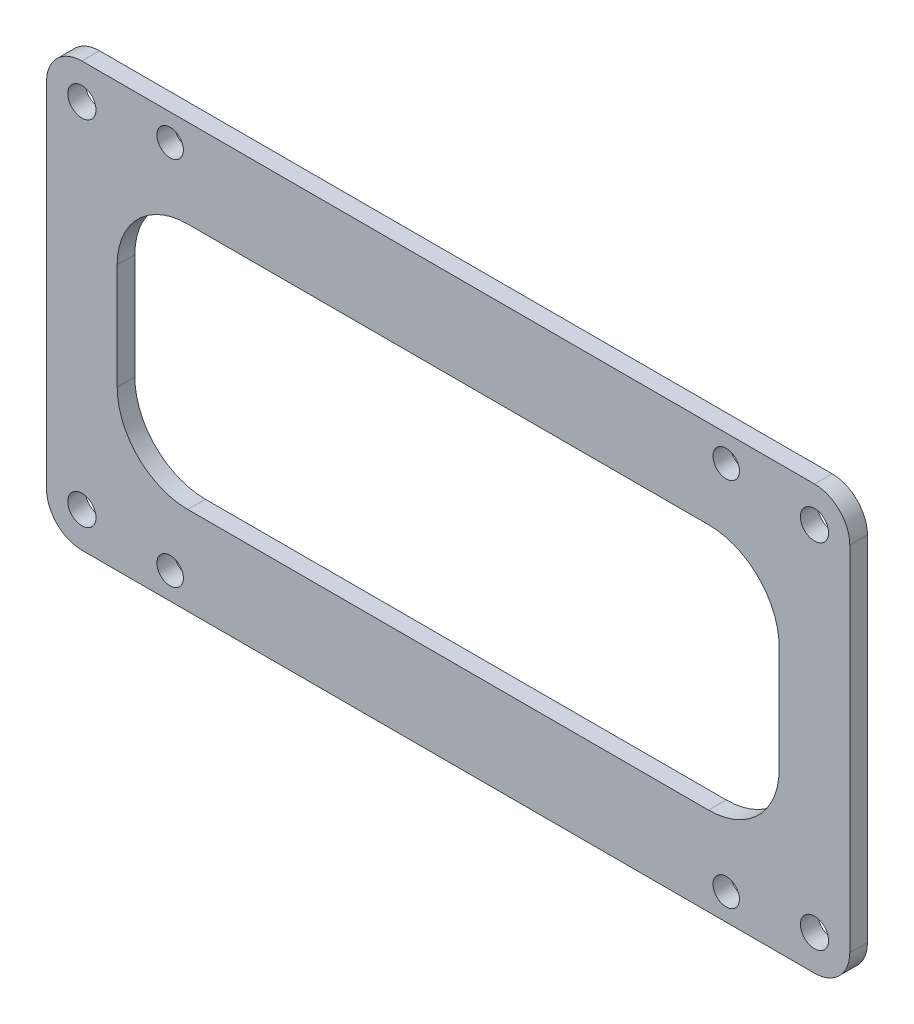
ISO-10303-21;
HEADER;
FILE_DESCRIPTION(('STEP AP214'),'2;1');
FILE_NAME('part.step','',(''),(''),'','','');
FILE_SCHEMA(('AUTOMOTIVE_DESIGN { 1 0 10303 214 1 1 1 1 }'));
ENDSEC;
DATA;
#1=APPLICATION_CONTEXT('core data for automotive mechanical design processes');
#2=APPLICATION_PROTOCOL_DEFINITION('international standard','automotive_design',2000,#1);
#3=PRODUCT_CONTEXT('',#1,'mechanical');
#4=PRODUCT('Part','Part','',(#3));
#5=PRODUCT_RELATED_PRODUCT_CATEGORY('part','',(#4));
#6=PRODUCT_DEFINITION_FORMATION('','',#4);
#7=PRODUCT_DEFINITION_CONTEXT('part definition',#1,'design');
#8=PRODUCT_DEFINITION('design','',#6,#7);
#9=PRODUCT_DEFINITION_SHAPE('','',#8);
#10=(LENGTH_UNIT() NAMED_UNIT(*) SI_UNIT(.MILLI.,.METRE.));
#11=(NAMED_UNIT(*) PLANE_ANGLE_UNIT() SI_UNIT($,.RADIAN.));
#12=(NAMED_UNIT(*) SI_UNIT($,.STERADIAN.) SOLID_ANGLE_UNIT());
#13=UNCERTAINTY_MEASURE_WITH_UNIT(LENGTH_MEASURE(1.E-05),#10,'distance_accuracy_value','');
#14=(GEOMETRIC_REPRESENTATION_CONTEXT(3) GLOBAL_UNCERTAINTY_ASSIGNED_CONTEXT((#13)) GLOBAL_UNIT_ASSIGNED_CONTEXT((#10,
#11,#12)) REPRESENTATION_CONTEXT('',''));
#15=CARTESIAN_POINT('',(0.,0.,0.));
#16=DIRECTION('',(0.,0.,1.));
#17=DIRECTION('',(1.,0.,0.));
#18=AXIS2_PLACEMENT_3D('',#15,#16,#17);
#19=CARTESIAN_POINT('',(-41.5,-20.,2.));
#20=DIRECTION('',(0.,0.,-1.));
#21=DIRECTION('',(-1.,0.,0.));
#22=AXIS2_PLACEMENT_3D('',#19,#20,#21);
#23=PLANE('',#22);
#24=CARTESIAN_POINT('',(41.5,-20.,2.));
#25=DIRECTION('',(0.,0.,1.));
#26=DIRECTION('',(1.,0.,0.));
#27=AXIS2_PLACEMENT_3D('',#24,#25,#26);
#28=CIRCLE('',#27,1.6);
#29=CARTESIAN_POINT('',(43.1,-20.,2.));
#30=VERTEX_POINT('',#29);
#31=EDGE_CURVE('E348',#30,#30,#28,.T.);
#32=ORIENTED_EDGE('',*,*,#31,.F.);
#33=EDGE_LOOP('',(#32));
#34=FACE_BOUND('',#33,.T.);
#35=CARTESIAN_POINT('',(41.5,20.,2.));
#36=DIRECTION('',(0.,0.,1.));
#37=DIRECTION('',(1.,0.,0.));
#38=AXIS2_PLACEMENT_3D('',#35,#36,#37);
#39=CIRCLE('',#38,1.6);
#40=CARTESIAN_POINT('',(43.1,20.,2.));
#41=VERTEX_POINT('',#40);
#42=EDGE_CURVE('E335',#41,#41,#39,.T.);
#43=ORIENTED_EDGE('',*,*,#42,.F.);
#44=EDGE_LOOP('',(#43));
#45=FACE_BOUND('',#44,.T.);
#46=CARTESIAN_POINT('',(-41.5,-20.,2.));
#47=DIRECTION('',(0.,0.,1.));
#48=DIRECTION('',(1.,0.,0.));
#49=AXIS2_PLACEMENT_3D('',#46,#47,#48);
#50=CIRCLE('',#49,1.6);
#51=CARTESIAN_POINT('',(-39.9,-20.,2.));
#52=VERTEX_POINT('',#51);
#53=EDGE_CURVE('E328',#52,#52,#50,.T.);
#54=ORIENTED_EDGE('',*,*,#53,.F.);
#55=EDGE_LOOP('',(#54));
#56=FACE_BOUND('',#55,.T.);
#57=CARTESIAN_POINT('',(-41.5,20.,2.));
#58=DIRECTION('',(0.,0.,1.));
#59=DIRECTION('',(1.,0.,0.));
#60=AXIS2_PLACEMENT_3D('',#57,#58,#59);
#61=CIRCLE('',#60,1.6);
#62=CARTESIAN_POINT('',(-39.9,20.,2.));
#63=VERTEX_POINT('',#62);
#64=EDGE_CURVE('E327',#63,#63,#61,.T.);
#65=ORIENTED_EDGE('',*,*,#64,.F.);
#66=EDGE_LOOP('',(#65));
#67=FACE_BOUND('',#66,.T.);
#68=CARTESIAN_POINT('',(-31.5,-21.,2.));
#69=DIRECTION('',(0.,0.,1.));
#70=DIRECTION('',(1.,0.,0.));
#71=AXIS2_PLACEMENT_3D('',#68,#69,#70);
#72=CIRCLE('',#71,1.5);
#73=CARTESIAN_POINT('',(-30.,-21.,2.));
#74=VERTEX_POINT('',#73);
#75=EDGE_CURVE('E312',#74,#74,#72,.T.);
#76=ORIENTED_EDGE('',*,*,#75,.F.);
#77=EDGE_LOOP('',(#76));
#78=FACE_BOUND('',#77,.T.);
#79=CARTESIAN_POINT('',(31.5,-21.,2.));
#80=DIRECTION('',(0.,0.,1.));
#81=DIRECTION('',(1.,0.,0.));
#82=AXIS2_PLACEMENT_3D('',#79,#80,#81);
#83=CIRCLE('',#82,1.5);
#84=CARTESIAN_POINT('',(33.,-21.,2.));
#85=VERTEX_POINT('',#84);
#86=EDGE_CURVE('E305',#85,#85,#83,.T.);
#87=ORIENTED_EDGE('',*,*,#86,.F.);
#88=EDGE_LOOP('',(#87));
#89=FACE_BOUND('',#88,.T.);
#90=CARTESIAN_POINT('',(31.5,21.,2.));
#91=DIRECTION('',(0.,0.,1.));
#92=DIRECTION('',(1.,0.,0.));
#93=AXIS2_PLACEMENT_3D('',#90,#91,#92);
#94=CIRCLE('',#93,1.5);
#95=CARTESIAN_POINT('',(33.,21.,2.));
#96=VERTEX_POINT('',#95);
#97=EDGE_CURVE('E304',#96,#96,#94,.T.);
#98=ORIENTED_EDGE('',*,*,#97,.F.);
#99=EDGE_LOOP('',(#98));
#100=FACE_BOUND('',#99,.T.);
#101=CARTESIAN_POINT('',(-31.5,21.,2.));
#102=DIRECTION('',(0.,0.,1.));
#103=DIRECTION('',(1.,0.,0.));
#104=AXIS2_PLACEMENT_3D('',#101,#102,#103);
#105=CIRCLE('',#104,1.5);
#106=CARTESIAN_POINT('',(-30.,21.,2.));
#107=VERTEX_POINT('',#106);
#108=EDGE_CURVE('E214',#107,#107,#105,.T.);
#109=ORIENTED_EDGE('',*,*,#108,.F.);
#110=EDGE_LOOP('',(#109));
#111=FACE_BOUND('',#110,.T.);
#112=CARTESIAN_POINT('',(-41.5,-20.,2.));
#113=DIRECTION('',(0.,0.,1.));
#114=DIRECTION('',(-1.,0.,0.));
#115=AXIS2_PLACEMENT_3D('',#112,#113,#114);
#116=CIRCLE('',#115,4.);
#117=CARTESIAN_POINT('',(-45.5,-20.,2.));
#118=VERTEX_POINT('',#117);
#119=CARTESIAN_POINT('',(-41.5,-24.,2.));
#120=VERTEX_POINT('',#119);
#121=EDGE_CURVE('E228',#118,#120,#116,.T.);
#122=ORIENTED_EDGE('',*,*,#121,.T.);
#123=DIRECTION('',(1.,0.,0.));
#124=VECTOR('',#123,1.);
#125=CARTESIAN_POINT('',(41.5,-24.,2.));
#126=LINE('',#125,#124);
#127=CARTESIAN_POINT('',(41.5,-24.,2.));
#128=VERTEX_POINT('',#127);
#129=EDGE_CURVE('E287',#120,#128,#126,.T.);
#130=ORIENTED_EDGE('',*,*,#129,.T.);
#131=CARTESIAN_POINT('',(41.5,-20.,2.));
#132=DIRECTION('',(0.,0.,1.));
#133=DIRECTION('',(1.,0.,0.));
#134=AXIS2_PLACEMENT_3D('',#131,#132,#133);
#135=CIRCLE('',#134,4.);
#136=CARTESIAN_POINT('',(45.5,-20.,2.));
#137=VERTEX_POINT('',#136);
#138=EDGE_CURVE('E252',#128,#137,#135,.T.);
#139=ORIENTED_EDGE('',*,*,#138,.T.);
#140=DIRECTION('',(0.,1.,0.));
#141=VECTOR('',#140,1.);
#142=CARTESIAN_POINT('',(45.5,-20.,2.));
#143=LINE('',#142,#141);
#144=CARTESIAN_POINT('',(45.5,20.,2.));
#145=VERTEX_POINT('',#144);
#146=EDGE_CURVE('E273',#137,#145,#143,.T.);
#147=ORIENTED_EDGE('',*,*,#146,.T.);
#148=CARTESIAN_POINT('',(41.5,20.,2.));
#149=DIRECTION('',(0.,0.,1.));
#150=DIRECTION('',(1.,0.,0.));
#151=AXIS2_PLACEMENT_3D('',#148,#149,#150);
#152=CIRCLE('',#151,4.);
#153=CARTESIAN_POINT('',(41.5,24.,2.));
#154=VERTEX_POINT('',#153);
#155=EDGE_CURVE('E269',#145,#154,#152,.T.);
#156=ORIENTED_EDGE('',*,*,#155,.T.);
#157=DIRECTION('',(-1.,0.,0.));
#158=VECTOR('',#157,1.);
#159=CARTESIAN_POINT('',(41.5,24.,2.));
#160=LINE('',#159,#158);
#161=CARTESIAN_POINT('',(-41.5,24.,2.));
#162=VERTEX_POINT('',#161);
#163=EDGE_CURVE('E272',#154,#162,#160,.T.);
#164=ORIENTED_EDGE('',*,*,#163,.T.);
#165=CARTESIAN_POINT('',(-41.5,20.,2.));
#166=DIRECTION('',(0.,0.,1.));
#167=DIRECTION('',(1.,0.,0.));
#168=AXIS2_PLACEMENT_3D('',#165,#166,#167);
#169=CIRCLE('',#168,4.);
#170=CARTESIAN_POINT('',(-45.5,20.,2.));
#171=VERTEX_POINT('',#170);
#172=EDGE_CURVE('E207',#162,#171,#169,.T.);
#173=ORIENTED_EDGE('',*,*,#172,.T.);
#174=DIRECTION('',(0.,-1.,0.));
#175=VECTOR('',#174,1.);
#176=CARTESIAN_POINT('',(-45.5,-20.,2.));
#177=LINE('',#176,#175);
#178=EDGE_CURVE('E203',#171,#118,#177,.T.);
#179=ORIENTED_EDGE('',*,*,#178,.T.);
#180=EDGE_LOOP('',(#122,#130,#139,#147,#156,#164,#173,#179));
#181=FACE_BOUND('',#180,.T.);
#182=CARTESIAN_POINT('',(-29.5,-6.00000000000001,2.));
#183=DIRECTION('',(0.,0.,1.));
#184=DIRECTION('',(-1.,0.,0.));
#185=AXIS2_PLACEMENT_3D('',#182,#183,#184);
#186=CIRCLE('',#185,8.);
#187=CARTESIAN_POINT('',(-37.5,-6.00000000000001,2.));
#188=VERTEX_POINT('',#187);
#189=CARTESIAN_POINT('',(-29.5,-14.,2.));
#190=VERTEX_POINT('',#189);
#191=EDGE_CURVE('E150',#188,#190,#186,.T.);
#192=ORIENTED_EDGE('',*,*,#191,.F.);
#193=DIRECTION('',(0.,-1.,0.));
#194=VECTOR('',#193,1.);
#195=CARTESIAN_POINT('',(-37.5,-6.00000000000001,2.));
#196=LINE('',#195,#194);
#197=CARTESIAN_POINT('',(-37.5,5.99999999999999,2.));
#198=VERTEX_POINT('',#197);
#199=EDGE_CURVE('E193',#198,#188,#196,.T.);
#200=ORIENTED_EDGE('',*,*,#199,.F.);
#201=CARTESIAN_POINT('',(-29.5,5.99999999999999,2.));
#202=DIRECTION('',(0.,0.,1.));
#203=DIRECTION('',(1.,0.,0.));
#204=AXIS2_PLACEMENT_3D('',#201,#202,#203);
#205=CIRCLE('',#204,8.);
#206=CARTESIAN_POINT('',(-29.5,14.,2.));
#207=VERTEX_POINT('',#206);
#208=EDGE_CURVE('E190',#207,#198,#205,.T.);
#209=ORIENTED_EDGE('',*,*,#208,.F.);
#210=DIRECTION('',(-1.,0.,0.));
#211=VECTOR('',#210,1.);
#212=CARTESIAN_POINT('',(29.5,14.,2.));
#213=LINE('',#212,#211);
#214=CARTESIAN_POINT('',(29.5,14.,2.));
#215=VERTEX_POINT('',#214);
#216=EDGE_CURVE('E187',#215,#207,#213,.T.);
#217=ORIENTED_EDGE('',*,*,#216,.F.);
#218=CARTESIAN_POINT('',(29.5,5.99999999999999,2.));
#219=DIRECTION('',(0.,0.,1.));
#220=DIRECTION('',(1.,0.,0.));
#221=AXIS2_PLACEMENT_3D('',#218,#219,#220);
#222=CIRCLE('',#221,8.);
#223=CARTESIAN_POINT('',(37.5,5.99999999999999,2.));
#224=VERTEX_POINT('',#223);
#225=EDGE_CURVE('E185',#224,#215,#222,.T.);
#226=ORIENTED_EDGE('',*,*,#225,.F.);
#227=DIRECTION('',(0.,1.,0.));
#228=VECTOR('',#227,1.);
#229=CARTESIAN_POINT('',(37.5,-6.00000000000001,2.));
#230=LINE('',#229,#228);
#231=CARTESIAN_POINT('',(37.5,-6.00000000000001,2.));
#232=VERTEX_POINT('',#231);
#233=EDGE_CURVE('E172',#232,#224,#230,.T.);
#234=ORIENTED_EDGE('',*,*,#233,.F.);
#235=CARTESIAN_POINT('',(29.5,-6.00000000000001,2.));
#236=DIRECTION('',(0.,0.,1.));
#237=DIRECTION('',(1.,0.,0.));
#238=AXIS2_PLACEMENT_3D('',#235,#236,#237);
#239=CIRCLE('',#238,8.);
#240=CARTESIAN_POINT('',(29.5,-14.,2.));
#241=VERTEX_POINT('',#240);
#242=EDGE_CURVE('E171',#241,#232,#239,.T.);
#243=ORIENTED_EDGE('',*,*,#242,.F.);
#244=DIRECTION('',(1.,0.,0.));
#245=VECTOR('',#244,1.);
#246=CARTESIAN_POINT('',(29.5,-14.,2.));
#247=LINE('',#246,#245);
#248=EDGE_CURVE('E158',#190,#241,#247,.T.);
#249=ORIENTED_EDGE('',*,*,#248,.F.);
#250=EDGE_LOOP('',(#192,#200,#209,#217,#226,#234,#243,#249));
#251=FACE_BOUND('',#250,.T.);
#252=ADVANCED_FACE('F37',(#34,#45,#56,#67,#78,#89,#100,#111,#181,#251),#23,.F.);
#253=CARTESIAN_POINT('',(-41.5,-20.,0.));
#254=DIRECTION('',(0.,0.,-1.));
#255=DIRECTION('',(-1.,0.,0.));
#256=AXIS2_PLACEMENT_3D('',#253,#254,#255);
#257=PLANE('',#256);
#258=CARTESIAN_POINT('',(41.5,20.,0.));
#259=DIRECTION('',(0.,0.,1.));
#260=DIRECTION('',(1.,0.,0.));
#261=AXIS2_PLACEMENT_3D('',#258,#259,#260);
#262=CIRCLE('',#261,1.6);
#263=CARTESIAN_POINT('',(43.1,20.,0.));
#264=VERTEX_POINT('',#263);
#265=EDGE_CURVE('E339',#264,#264,#262,.T.);
#266=ORIENTED_EDGE('',*,*,#265,.T.);
#267=EDGE_LOOP('',(#266));
#268=FACE_BOUND('',#267,.T.);
#269=CARTESIAN_POINT('',(-41.5,20.,0.));
#270=DIRECTION('',(0.,0.,1.));
#271=DIRECTION('',(1.,0.,0.));
#272=AXIS2_PLACEMENT_3D('',#269,#270,#271);
#273=CIRCLE('',#272,1.6);
#274=CARTESIAN_POINT('',(-39.9,20.,0.));
#275=VERTEX_POINT('',#274);
#276=EDGE_CURVE('E325',#275,#275,#273,.T.);
#277=ORIENTED_EDGE('',*,*,#276,.T.);
#278=EDGE_LOOP('',(#277));
#279=FACE_BOUND('',#278,.T.);
#280=CARTESIAN_POINT('',(31.5,-21.,0.));
#281=DIRECTION('',(0.,0.,1.));
#282=DIRECTION('',(1.,0.,0.));
#283=AXIS2_PLACEMENT_3D('',#280,#281,#282);
#284=CIRCLE('',#283,1.5);
#285=CARTESIAN_POINT('',(33.,-21.,0.));
#286=VERTEX_POINT('',#285);
#287=EDGE_CURVE('E309',#286,#286,#284,.T.);
#288=ORIENTED_EDGE('',*,*,#287,.T.);
#289=EDGE_LOOP('',(#288));
#290=FACE_BOUND('',#289,.T.);
#291=CARTESIAN_POINT('',(-31.5,21.,0.));
#292=DIRECTION('',(0.,0.,1.));
#293=DIRECTION('',(1.,0.,0.));
#294=AXIS2_PLACEMENT_3D('',#291,#292,#293);
#295=CIRCLE('',#294,1.5);
#296=CARTESIAN_POINT('',(-30.,21.,0.));
#297=VERTEX_POINT('',#296);
#298=EDGE_CURVE('E293',#297,#297,#295,.T.);
#299=ORIENTED_EDGE('',*,*,#298,.T.);
#300=EDGE_LOOP('',(#299));
#301=FACE_BOUND('',#300,.T.);
#302=CARTESIAN_POINT('',(-41.5,-20.,0.));
#303=DIRECTION('',(0.,0.,1.));
#304=DIRECTION('',(-1.,0.,0.));
#305=AXIS2_PLACEMENT_3D('',#302,#303,#304);
#306=CIRCLE('',#305,4.);
#307=CARTESIAN_POINT('',(-45.5,-20.,0.));
#308=VERTEX_POINT('',#307);
#309=CARTESIAN_POINT('',(-41.5,-24.,0.));
#310=VERTEX_POINT('',#309);
#311=EDGE_CURVE('E210',#308,#310,#306,.T.);
#312=ORIENTED_EDGE('',*,*,#311,.F.);
#313=DIRECTION('',(0.,-1.,0.));
#314=VECTOR('',#313,1.);
#315=CARTESIAN_POINT('',(-45.5,-20.,0.));
#316=LINE('',#315,#314);
#317=CARTESIAN_POINT('',(-45.5,20.,0.));
#318=VERTEX_POINT('',#317);
#319=EDGE_CURVE('E226',#318,#308,#316,.T.);
#320=ORIENTED_EDGE('',*,*,#319,.F.);
#321=CARTESIAN_POINT('',(-41.5,20.,0.));
#322=DIRECTION('',(0.,0.,1.));
#323=DIRECTION('',(1.,0.,0.));
#324=AXIS2_PLACEMENT_3D('',#321,#322,#323);
#325=CIRCLE('',#324,4.);
#326=CARTESIAN_POINT('',(-41.5,24.,0.));
#327=VERTEX_POINT('',#326);
#328=EDGE_CURVE('E224',#327,#318,#325,.T.);
#329=ORIENTED_EDGE('',*,*,#328,.F.);
#330=DIRECTION('',(-1.,0.,0.));
#331=VECTOR('',#330,1.);
#332=CARTESIAN_POINT('',(41.5,24.,0.));
#333=LINE('',#332,#331);
#334=CARTESIAN_POINT('',(41.5,24.,0.));
#335=VERTEX_POINT('',#334);
#336=EDGE_CURVE('E222',#335,#327,#333,.T.);
#337=ORIENTED_EDGE('',*,*,#336,.F.);
#338=CARTESIAN_POINT('',(41.5,20.,0.));
#339=DIRECTION('',(0.,0.,1.));
#340=DIRECTION('',(1.,0.,0.));
#341=AXIS2_PLACEMENT_3D('',#338,#339,#340);
#342=CIRCLE('',#341,4.);
#343=CARTESIAN_POINT('',(45.5,20.,0.));
#344=VERTEX_POINT('',#343);
#345=EDGE_CURVE('E220',#344,#335,#342,.T.);
#346=ORIENTED_EDGE('',*,*,#345,.F.);
#347=DIRECTION('',(0.,1.,0.));
#348=VECTOR('',#347,1.);
#349=CARTESIAN_POINT('',(45.5,-20.,0.));
#350=LINE('',#349,#348);
#351=CARTESIAN_POINT('',(45.5,-20.,0.));
#352=VERTEX_POINT('',#351);
#353=EDGE_CURVE('E218',#352,#344,#350,.T.);
#354=ORIENTED_EDGE('',*,*,#353,.F.);
#355=CARTESIAN_POINT('',(41.5,-20.,0.));
#356=DIRECTION('',(0.,0.,1.));
#357=DIRECTION('',(1.,0.,0.));
#358=AXIS2_PLACEMENT_3D('',#355,#356,#357);
#359=CIRCLE('',#358,4.);
#360=CARTESIAN_POINT('',(41.5,-24.,0.));
#361=VERTEX_POINT('',#360);
#362=EDGE_CURVE('E216',#361,#352,#359,.T.);
#363=ORIENTED_EDGE('',*,*,#362,.F.);
#364=DIRECTION('',(1.,0.,0.));
#365=VECTOR('',#364,1.);
#366=CARTESIAN_POINT('',(41.5,-24.,0.));
#367=LINE('',#366,#365);
#368=EDGE_CURVE('E213',#310,#361,#367,.T.);
#369=ORIENTED_EDGE('',*,*,#368,.F.);
#370=EDGE_LOOP('',(#312,#320,#329,#337,#346,#354,#363,#369));
#371=FACE_BOUND('',#370,.T.);
#372=CARTESIAN_POINT('',(31.5,21.,0.));
#373=DIRECTION('',(0.,0.,1.));
#374=DIRECTION('',(1.,0.,0.));
#375=AXIS2_PLACEMENT_3D('',#372,#373,#374);
#376=CIRCLE('',#375,1.5);
#377=CARTESIAN_POINT('',(33.,21.,0.));
#378=VERTEX_POINT('',#377);
#379=EDGE_CURVE('E302',#378,#378,#376,.T.);
#380=ORIENTED_EDGE('',*,*,#379,.T.);
#381=EDGE_LOOP('',(#380));
#382=FACE_BOUND('',#381,.T.);
#383=CARTESIAN_POINT('',(-31.5,-21.,0.));
#384=DIRECTION('',(0.,0.,1.));
#385=DIRECTION('',(1.,0.,0.));
#386=AXIS2_PLACEMENT_3D('',#383,#384,#385);
#387=CIRCLE('',#386,1.5);
#388=CARTESIAN_POINT('',(-30.,-21.,0.));
#389=VERTEX_POINT('',#388);
#390=EDGE_CURVE('E316',#389,#389,#387,.T.);
#391=ORIENTED_EDGE('',*,*,#390,.T.);
#392=EDGE_LOOP('',(#391));
#393=FACE_BOUND('',#392,.T.);
#394=CARTESIAN_POINT('',(-41.5,-20.,0.));
#395=DIRECTION('',(0.,0.,1.));
#396=DIRECTION('',(1.,0.,0.));
#397=AXIS2_PLACEMENT_3D('',#394,#395,#396);
#398=CIRCLE('',#397,1.6);
#399=CARTESIAN_POINT('',(-39.9,-20.,0.));
#400=VERTEX_POINT('',#399);
#401=EDGE_CURVE('E332',#400,#400,#398,.T.);
#402=ORIENTED_EDGE('',*,*,#401,.T.);
#403=EDGE_LOOP('',(#402));
#404=FACE_BOUND('',#403,.T.);
#405=CARTESIAN_POINT('',(41.5,-20.,0.));
#406=DIRECTION('',(0.,0.,1.));
#407=DIRECTION('',(1.,0.,0.));
#408=AXIS2_PLACEMENT_3D('',#405,#406,#407);
#409=CIRCLE('',#408,1.6);
#410=CARTESIAN_POINT('',(43.1,-20.,0.));
#411=VERTEX_POINT('',#410);
#412=EDGE_CURVE('E166',#411,#411,#409,.T.);
#413=ORIENTED_EDGE('',*,*,#412,.T.);
#414=EDGE_LOOP('',(#413));
#415=FACE_BOUND('',#414,.T.);
#416=DIRECTION('',(0.,-1.,0.));
#417=VECTOR('',#416,1.);
#418=CARTESIAN_POINT('',(-37.5,-6.00000000000001,0.));
#419=LINE('',#418,#417);
#420=CARTESIAN_POINT('',(-37.5,5.99999999999999,0.));
#421=VERTEX_POINT('',#420);
#422=CARTESIAN_POINT('',(-37.5,-6.00000000000001,0.));
#423=VERTEX_POINT('',#422);
#424=EDGE_CURVE('E159',#421,#423,#419,.T.);
#425=ORIENTED_EDGE('',*,*,#424,.T.);
#426=CARTESIAN_POINT('',(-29.5,-6.00000000000001,0.));
#427=DIRECTION('',(0.,0.,1.));
#428=DIRECTION('',(-1.,0.,0.));
#429=AXIS2_PLACEMENT_3D('',#426,#427,#428);
#430=CIRCLE('',#429,8.);
#431=CARTESIAN_POINT('',(-29.5,-14.,0.));
#432=VERTEX_POINT('',#431);
#433=EDGE_CURVE('E60',#423,#432,#430,.T.);
#434=ORIENTED_EDGE('',*,*,#433,.T.);
#435=DIRECTION('',(1.,0.,0.));
#436=VECTOR('',#435,1.);
#437=CARTESIAN_POINT('',(29.5,-14.,0.));
#438=LINE('',#437,#436);
#439=CARTESIAN_POINT('',(29.5,-14.,0.));
#440=VERTEX_POINT('',#439);
#441=EDGE_CURVE('E165',#432,#440,#438,.T.);
#442=ORIENTED_EDGE('',*,*,#441,.T.);
#443=CARTESIAN_POINT('',(29.5,-6.00000000000001,0.));
#444=DIRECTION('',(0.,0.,1.));
#445=DIRECTION('',(1.,0.,0.));
#446=AXIS2_PLACEMENT_3D('',#443,#444,#445);
#447=CIRCLE('',#446,8.);
#448=CARTESIAN_POINT('',(37.5,-6.00000000000001,0.));
#449=VERTEX_POINT('',#448);
#450=EDGE_CURVE('E377',#440,#449,#447,.T.);
#451=ORIENTED_EDGE('',*,*,#450,.T.);
#452=DIRECTION('',(0.,1.,0.));
#453=VECTOR('',#452,1.);
#454=CARTESIAN_POINT('',(37.5,-6.00000000000001,0.));
#455=LINE('',#454,#453);
#456=CARTESIAN_POINT('',(37.5,5.99999999999999,0.));
#457=VERTEX_POINT('',#456);
#458=EDGE_CURVE('E374',#449,#457,#455,.T.);
#459=ORIENTED_EDGE('',*,*,#458,.T.);
#460=CARTESIAN_POINT('',(29.5,5.99999999999999,0.));
#461=DIRECTION('',(0.,0.,1.));
#462=DIRECTION('',(1.,0.,0.));
#463=AXIS2_PLACEMENT_3D('',#460,#461,#462);
#464=CIRCLE('',#463,8.);
#465=CARTESIAN_POINT('',(29.5,14.,0.));
#466=VERTEX_POINT('',#465);
#467=EDGE_CURVE('E371',#457,#466,#464,.T.);
#468=ORIENTED_EDGE('',*,*,#467,.T.);
#469=DIRECTION('',(-1.,0.,0.));
#470=VECTOR('',#469,1.);
#471=CARTESIAN_POINT('',(29.5,14.,0.));
#472=LINE('',#471,#470);
#473=CARTESIAN_POINT('',(-29.5,14.,0.));
#474=VERTEX_POINT('',#473);
#475=EDGE_CURVE('E368',#466,#474,#472,.T.);
#476=ORIENTED_EDGE('',*,*,#475,.T.);
#477=CARTESIAN_POINT('',(-29.5,5.99999999999999,0.));
#478=DIRECTION('',(0.,0.,1.));
#479=DIRECTION('',(1.,0.,0.));
#480=AXIS2_PLACEMENT_3D('',#477,#478,#479);
#481=CIRCLE('',#480,8.);
#482=EDGE_CURVE('E365',#474,#421,#481,.T.);
#483=ORIENTED_EDGE('',*,*,#482,.T.);
#484=EDGE_LOOP('',(#425,#434,#442,#451,#459,#468,#476,#483));
#485=FACE_BOUND('',#484,.T.);
#486=ADVANCED_FACE('F257',(#268,#279,#290,#301,#371,#382,#393,#404,#415,#485),#257,.T.);
#487=CARTESIAN_POINT('',(-41.5,-20.,2.));
#488=DIRECTION('',(0.,0.,-1.));
#489=DIRECTION('',(-1.,0.,0.));
#490=AXIS2_PLACEMENT_3D('',#487,#488,#489);
#491=CYLINDRICAL_SURFACE('',#490,4.);
#492=ORIENTED_EDGE('',*,*,#311,.T.);
#493=DIRECTION('',(0.,0.,-1.));
#494=VECTOR('',#493,1.);
#495=CARTESIAN_POINT('',(-41.5,-24.,2.));
#496=LINE('',#495,#494);
#497=EDGE_CURVE('E12',#120,#310,#496,.T.);
#498=ORIENTED_EDGE('',*,*,#497,.F.);
#499=ORIENTED_EDGE('',*,*,#121,.F.);
#500=DIRECTION('',(0.,0.,-1.));
#501=VECTOR('',#500,1.);
#502=CARTESIAN_POINT('',(-45.5,-20.,2.));
#503=LINE('',#502,#501);
#504=EDGE_CURVE('E206',#118,#308,#503,.T.);
#505=ORIENTED_EDGE('',*,*,#504,.T.);
#506=EDGE_LOOP('',(#492,#498,#499,#505));
#507=FACE_BOUND('',#506,.T.);
#508=ADVANCED_FACE('F39',(#507),#491,.T.);
#509=CARTESIAN_POINT('',(41.5,-24.,2.));
#510=DIRECTION('',(0.,1.,0.));
#511=DIRECTION('',(-1.,0.,0.));
#512=AXIS2_PLACEMENT_3D('',#509,#510,#511);
#513=PLANE('',#512);
#514=ORIENTED_EDGE('',*,*,#368,.T.);
#515=DIRECTION('',(0.,0.,-1.));
#516=VECTOR('',#515,1.);
#517=CARTESIAN_POINT('',(41.5,-24.,2.));
#518=LINE('',#517,#516);
#519=EDGE_CURVE('E45',#128,#361,#518,.T.);
#520=ORIENTED_EDGE('',*,*,#519,.F.);
#521=ORIENTED_EDGE('',*,*,#129,.F.);
#522=ORIENTED_EDGE('',*,*,#497,.T.);
#523=EDGE_LOOP('',(#514,#520,#521,#522));
#524=FACE_BOUND('',#523,.T.);
#525=ADVANCED_FACE('F443',(#524),#513,.F.);
#526=CARTESIAN_POINT('',(41.5,-20.,2.));
#527=DIRECTION('',(0.,0.,-1.));
#528=DIRECTION('',(-1.,0.,0.));
#529=AXIS2_PLACEMENT_3D('',#526,#527,#528);
#530=CYLINDRICAL_SURFACE('',#529,4.);
#531=ORIENTED_EDGE('',*,*,#362,.T.);
#532=DIRECTION('',(0.,0.,-1.));
#533=VECTOR('',#532,1.);
#534=CARTESIAN_POINT('',(45.5,-20.,2.));
#535=LINE('',#534,#533);
#536=EDGE_CURVE('E243',#137,#352,#535,.T.);
#537=ORIENTED_EDGE('',*,*,#536,.F.);
#538=ORIENTED_EDGE('',*,*,#138,.F.);
#539=ORIENTED_EDGE('',*,*,#519,.T.);
#540=EDGE_LOOP('',(#531,#537,#538,#539));
#541=FACE_BOUND('',#540,.T.);
#542=ADVANCED_FACE('F250',(#541),#530,.T.);
#543=CARTESIAN_POINT('',(45.5,-20.,2.));
#544=DIRECTION('',(-1.,0.,0.));
#545=DIRECTION('',(0.,0.,1.));
#546=AXIS2_PLACEMENT_3D('',#543,#544,#545);
#547=PLANE('',#546);
#548=ORIENTED_EDGE('',*,*,#353,.T.);
#549=DIRECTION('',(0.,0.,-1.));
#550=VECTOR('',#549,1.);
#551=CARTESIAN_POINT('',(45.5,20.,2.));
#552=LINE('',#551,#550);
#553=EDGE_CURVE('E240',#145,#344,#552,.T.);
#554=ORIENTED_EDGE('',*,*,#553,.F.);
#555=ORIENTED_EDGE('',*,*,#146,.F.);
#556=ORIENTED_EDGE('',*,*,#536,.T.);
#557=EDGE_LOOP('',(#548,#554,#555,#556));
#558=FACE_BOUND('',#557,.T.);
#559=ADVANCED_FACE('F263',(#558),#547,.F.);
#560=CARTESIAN_POINT('',(41.5,20.,2.));
#561=DIRECTION('',(0.,0.,-1.));
#562=DIRECTION('',(-1.,0.,0.));
#563=AXIS2_PLACEMENT_3D('',#560,#561,#562);
#564=CYLINDRICAL_SURFACE('',#563,4.);
#565=ORIENTED_EDGE('',*,*,#345,.T.);
#566=DIRECTION('',(0.,0.,-1.));
#567=VECTOR('',#566,1.);
#568=CARTESIAN_POINT('',(41.5,24.,2.));
#569=LINE('',#568,#567);
#570=EDGE_CURVE('E237',#154,#335,#569,.T.);
#571=ORIENTED_EDGE('',*,*,#570,.F.);
#572=ORIENTED_EDGE('',*,*,#155,.F.);
#573=ORIENTED_EDGE('',*,*,#553,.T.);
#574=EDGE_LOOP('',(#565,#571,#572,#573));
#575=FACE_BOUND('',#574,.T.);
#576=ADVANCED_FACE('F267',(#575),#564,.T.);
#577=CARTESIAN_POINT('',(41.5,24.,2.));
#578=DIRECTION('',(0.,-1.,0.));
#579=DIRECTION('',(0.,0.,-1.));
#580=AXIS2_PLACEMENT_3D('',#577,#578,#579);
#581=PLANE('',#580);
#582=ORIENTED_EDGE('',*,*,#336,.T.);
#583=DIRECTION('',(0.,0.,-1.));
#584=VECTOR('',#583,1.);
#585=CARTESIAN_POINT('',(-41.5,24.,2.));
#586=LINE('',#585,#584);
#587=EDGE_CURVE('E234',#162,#327,#586,.T.);
#588=ORIENTED_EDGE('',*,*,#587,.F.);
#589=ORIENTED_EDGE('',*,*,#163,.F.);
#590=ORIENTED_EDGE('',*,*,#570,.T.);
#591=EDGE_LOOP('',(#582,#588,#589,#590));
#592=FACE_BOUND('',#591,.T.);
#593=ADVANCED_FACE('F433',(#592),#581,.F.);
#594=CARTESIAN_POINT('',(-41.5,20.,2.));
#595=DIRECTION('',(0.,0.,-1.));
#596=DIRECTION('',(-1.,0.,0.));
#597=AXIS2_PLACEMENT_3D('',#594,#595,#596);
#598=CYLINDRICAL_SURFACE('',#597,4.);
#599=ORIENTED_EDGE('',*,*,#328,.T.);
#600=DIRECTION('',(0.,0.,-1.));
#601=VECTOR('',#600,1.);
#602=CARTESIAN_POINT('',(-45.5,20.,2.));
#603=LINE('',#602,#601);
#604=EDGE_CURVE('E231',#171,#318,#603,.T.);
#605=ORIENTED_EDGE('',*,*,#604,.F.);
#606=ORIENTED_EDGE('',*,*,#172,.F.);
#607=ORIENTED_EDGE('',*,*,#587,.T.);
#608=EDGE_LOOP('',(#599,#605,#606,#607));
#609=FACE_BOUND('',#608,.T.);
#610=ADVANCED_FACE('F429',(#609),#598,.T.);
#611=CARTESIAN_POINT('',(-45.5,-20.,2.));
#612=DIRECTION('',(1.,0.,0.));
#613=DIRECTION('',(0.,0.,-1.));
#614=AXIS2_PLACEMENT_3D('',#611,#612,#613);
#615=PLANE('',#614);
#616=ORIENTED_EDGE('',*,*,#319,.T.);
#617=ORIENTED_EDGE('',*,*,#504,.F.);
#618=ORIENTED_EDGE('',*,*,#178,.F.);
#619=ORIENTED_EDGE('',*,*,#604,.T.);
#620=EDGE_LOOP('',(#616,#617,#618,#619));
#621=FACE_BOUND('',#620,.T.);
#622=ADVANCED_FACE('F426',(#621),#615,.F.);
#623=CARTESIAN_POINT('',(-31.5,21.,2.));
#624=DIRECTION('',(0.,0.,-1.));
#625=DIRECTION('',(-1.,0.,0.));
#626=AXIS2_PLACEMENT_3D('',#623,#624,#625);
#627=CYLINDRICAL_SURFACE('',#626,1.5);
#628=ORIENTED_EDGE('',*,*,#108,.T.);
#629=EDGE_LOOP('',(#628));
#630=FACE_BOUND('',#629,.T.);
#631=ORIENTED_EDGE('',*,*,#298,.F.);
#632=EDGE_LOOP('',(#631));
#633=FACE_BOUND('',#632,.T.);
#634=ADVANCED_FACE('F423',(#630,#633),#627,.F.);
#635=CARTESIAN_POINT('',(31.5,21.,2.));
#636=DIRECTION('',(0.,0.,-1.));
#637=DIRECTION('',(-1.,0.,0.));
#638=AXIS2_PLACEMENT_3D('',#635,#636,#637);
#639=CYLINDRICAL_SURFACE('',#638,1.5);
#640=ORIENTED_EDGE('',*,*,#97,.T.);
#641=EDGE_LOOP('',(#640));
#642=FACE_BOUND('',#641,.T.);
#643=ORIENTED_EDGE('',*,*,#379,.F.);
#644=EDGE_LOOP('',(#643));
#645=FACE_BOUND('',#644,.T.);
#646=ADVANCED_FACE('F514',(#642,#645),#639,.F.);
#647=CARTESIAN_POINT('',(31.5,-21.,2.));
#648=DIRECTION('',(0.,0.,-1.));
#649=DIRECTION('',(-1.,0.,0.));
#650=AXIS2_PLACEMENT_3D('',#647,#648,#649);
#651=CYLINDRICAL_SURFACE('',#650,1.5);
#652=ORIENTED_EDGE('',*,*,#86,.T.);
#653=EDGE_LOOP('',(#652));
#654=FACE_BOUND('',#653,.T.);
#655=ORIENTED_EDGE('',*,*,#287,.F.);
#656=EDGE_LOOP('',(#655));
#657=FACE_BOUND('',#656,.T.);
#658=ADVANCED_FACE('F522',(#654,#657),#651,.F.);
#659=CARTESIAN_POINT('',(-31.5,-21.,2.));
#660=DIRECTION('',(0.,0.,-1.));
#661=DIRECTION('',(-1.,0.,0.));
#662=AXIS2_PLACEMENT_3D('',#659,#660,#661);
#663=CYLINDRICAL_SURFACE('',#662,1.5);
#664=ORIENTED_EDGE('',*,*,#75,.T.);
#665=EDGE_LOOP('',(#664));
#666=FACE_BOUND('',#665,.T.);
#667=ORIENTED_EDGE('',*,*,#390,.F.);
#668=EDGE_LOOP('',(#667));
#669=FACE_BOUND('',#668,.T.);
#670=ADVANCED_FACE('F530',(#666,#669),#663,.F.);
#671=CARTESIAN_POINT('',(-41.5,20.,2.));
#672=DIRECTION('',(0.,0.,-1.));
#673=DIRECTION('',(-1.,0.,0.));
#674=AXIS2_PLACEMENT_3D('',#671,#672,#673);
#675=CYLINDRICAL_SURFACE('',#674,1.6);
#676=ORIENTED_EDGE('',*,*,#64,.T.);
#677=EDGE_LOOP('',(#676));
#678=FACE_BOUND('',#677,.T.);
#679=ORIENTED_EDGE('',*,*,#276,.F.);
#680=EDGE_LOOP('',(#679));
#681=FACE_BOUND('',#680,.T.);
#682=ADVANCED_FACE('F539',(#678,#681),#675,.F.);
#683=CARTESIAN_POINT('',(-41.5,-20.,2.));
#684=DIRECTION('',(0.,0.,-1.));
#685=DIRECTION('',(-1.,0.,0.));
#686=AXIS2_PLACEMENT_3D('',#683,#684,#685);
#687=CYLINDRICAL_SURFACE('',#686,1.6);
#688=ORIENTED_EDGE('',*,*,#53,.T.);
#689=EDGE_LOOP('',(#688));
#690=FACE_BOUND('',#689,.T.);
#691=ORIENTED_EDGE('',*,*,#401,.F.);
#692=EDGE_LOOP('',(#691));
#693=FACE_BOUND('',#692,.T.);
#694=ADVANCED_FACE('F548',(#690,#693),#687,.F.);
#695=CARTESIAN_POINT('',(41.5,20.,2.));
#696=DIRECTION('',(0.,0.,-1.));
#697=DIRECTION('',(-1.,0.,0.));
#698=AXIS2_PLACEMENT_3D('',#695,#696,#697);
#699=CYLINDRICAL_SURFACE('',#698,1.6);
#700=ORIENTED_EDGE('',*,*,#42,.T.);
#701=EDGE_LOOP('',(#700));
#702=FACE_BOUND('',#701,.T.);
#703=ORIENTED_EDGE('',*,*,#265,.F.);
#704=EDGE_LOOP('',(#703));
#705=FACE_BOUND('',#704,.T.);
#706=ADVANCED_FACE('F557',(#702,#705),#699,.F.);
#707=CARTESIAN_POINT('',(41.5,-20.,2.));
#708=DIRECTION('',(0.,0.,-1.));
#709=DIRECTION('',(-1.,0.,0.));
#710=AXIS2_PLACEMENT_3D('',#707,#708,#709);
#711=CYLINDRICAL_SURFACE('',#710,1.6);
#712=ORIENTED_EDGE('',*,*,#31,.T.);
#713=EDGE_LOOP('',(#712));
#714=FACE_BOUND('',#713,.T.);
#715=ORIENTED_EDGE('',*,*,#412,.F.);
#716=EDGE_LOOP('',(#715));
#717=FACE_BOUND('',#716,.T.);
#718=ADVANCED_FACE('F566',(#714,#717),#711,.F.);
#719=CARTESIAN_POINT('',(-29.5,-6.00000000000001,2.));
#720=DIRECTION('',(0.,0.,-1.));
#721=DIRECTION('',(-1.,0.,0.));
#722=AXIS2_PLACEMENT_3D('',#719,#720,#721);
#723=CYLINDRICAL_SURFACE('',#722,8.);
#724=ORIENTED_EDGE('',*,*,#433,.F.);
#725=DIRECTION('',(0.,0.,-1.));
#726=VECTOR('',#725,1.);
#727=CARTESIAN_POINT('',(-37.5,-6.00000000000001,2.));
#728=LINE('',#727,#726);
#729=EDGE_CURVE('E154',#188,#423,#728,.T.);
#730=ORIENTED_EDGE('',*,*,#729,.F.);
#731=ORIENTED_EDGE('',*,*,#191,.T.);
#732=DIRECTION('',(0.,0.,-1.));
#733=VECTOR('',#732,1.);
#734=CARTESIAN_POINT('',(-29.5,-14.,2.));
#735=LINE('',#734,#733);
#736=EDGE_CURVE('E153',#190,#432,#735,.T.);
#737=ORIENTED_EDGE('',*,*,#736,.T.);
#738=EDGE_LOOP('',(#724,#730,#731,#737));
#739=FACE_BOUND('',#738,.T.);
#740=ADVANCED_FACE('F152',(#739),#723,.F.);
#741=CARTESIAN_POINT('',(29.5,-14.,2.));
#742=DIRECTION('',(0.,1.,0.));
#743=DIRECTION('',(0.,0.,1.));
#744=AXIS2_PLACEMENT_3D('',#741,#742,#743);
#745=PLANE('',#744);
#746=ORIENTED_EDGE('',*,*,#441,.F.);
#747=ORIENTED_EDGE('',*,*,#736,.F.);
#748=ORIENTED_EDGE('',*,*,#248,.T.);
#749=DIRECTION('',(0.,0.,-1.));
#750=VECTOR('',#749,1.);
#751=CARTESIAN_POINT('',(29.5,-14.,2.));
#752=LINE('',#751,#750);
#753=EDGE_CURVE('E167',#241,#440,#752,.T.);
#754=ORIENTED_EDGE('',*,*,#753,.T.);
#755=EDGE_LOOP('',(#746,#747,#748,#754));
#756=FACE_BOUND('',#755,.T.);
#757=ADVANCED_FACE('F162',(#756),#745,.T.);
#758=CARTESIAN_POINT('',(29.5,-6.00000000000001,2.));
#759=DIRECTION('',(0.,0.,-1.));
#760=DIRECTION('',(-1.,0.,0.));
#761=AXIS2_PLACEMENT_3D('',#758,#759,#760);
#762=CYLINDRICAL_SURFACE('',#761,8.);
#763=ORIENTED_EDGE('',*,*,#450,.F.);
#764=ORIENTED_EDGE('',*,*,#753,.F.);
#765=ORIENTED_EDGE('',*,*,#242,.T.);
#766=DIRECTION('',(0.,0.,-1.));
#767=VECTOR('',#766,1.);
#768=CARTESIAN_POINT('',(37.5,-6.00000000000001,2.));
#769=LINE('',#768,#767);
#770=EDGE_CURVE('E353',#232,#449,#769,.T.);
#771=ORIENTED_EDGE('',*,*,#770,.T.);
#772=EDGE_LOOP('',(#763,#764,#765,#771));
#773=FACE_BOUND('',#772,.T.);
#774=ADVANCED_FACE('F403',(#773),#762,.F.);
#775=CARTESIAN_POINT('',(37.5,-6.00000000000001,2.));
#776=DIRECTION('',(-1.,0.,0.));
#777=DIRECTION('',(0.,-1.,0.));
#778=AXIS2_PLACEMENT_3D('',#775,#776,#777);
#779=PLANE('',#778);
#780=ORIENTED_EDGE('',*,*,#458,.F.);
#781=ORIENTED_EDGE('',*,*,#770,.F.);
#782=ORIENTED_EDGE('',*,*,#233,.T.);
#783=DIRECTION('',(0.,0.,-1.));
#784=VECTOR('',#783,1.);
#785=CARTESIAN_POINT('',(37.5,5.99999999999999,2.));
#786=LINE('',#785,#784);
#787=EDGE_CURVE('E355',#224,#457,#786,.T.);
#788=ORIENTED_EDGE('',*,*,#787,.T.);
#789=EDGE_LOOP('',(#780,#781,#782,#788));
#790=FACE_BOUND('',#789,.T.);
#791=ADVANCED_FACE('F400',(#790),#779,.T.);
#792=CARTESIAN_POINT('',(29.5,5.99999999999999,2.));
#793=DIRECTION('',(0.,0.,-1.));
#794=DIRECTION('',(-1.,0.,0.));
#795=AXIS2_PLACEMENT_3D('',#792,#793,#794);
#796=CYLINDRICAL_SURFACE('',#795,8.);
#797=ORIENTED_EDGE('',*,*,#467,.F.);
#798=ORIENTED_EDGE('',*,*,#787,.F.);
#799=ORIENTED_EDGE('',*,*,#225,.T.);
#800=DIRECTION('',(0.,0.,-1.));
#801=VECTOR('',#800,1.);
#802=CARTESIAN_POINT('',(29.5,14.,2.));
#803=LINE('',#802,#801);
#804=EDGE_CURVE('E357',#215,#466,#803,.T.);
#805=ORIENTED_EDGE('',*,*,#804,.T.);
#806=EDGE_LOOP('',(#797,#798,#799,#805));
#807=FACE_BOUND('',#806,.T.);
#808=ADVANCED_FACE('F395',(#807),#796,.F.);
#809=CARTESIAN_POINT('',(29.5,14.,2.));
#810=DIRECTION('',(0.,-1.,0.));
#811=DIRECTION('',(0.,0.,-1.));
#812=AXIS2_PLACEMENT_3D('',#809,#810,#811);
#813=PLANE('',#812);
#814=ORIENTED_EDGE('',*,*,#475,.F.);
#815=ORIENTED_EDGE('',*,*,#804,.F.);
#816=ORIENTED_EDGE('',*,*,#216,.T.);
#817=DIRECTION('',(0.,0.,-1.));
#818=VECTOR('',#817,1.);
#819=CARTESIAN_POINT('',(-29.5,14.,2.));
#820=LINE('',#819,#818);
#821=EDGE_CURVE('E359',#207,#474,#820,.T.);
#822=ORIENTED_EDGE('',*,*,#821,.T.);
#823=EDGE_LOOP('',(#814,#815,#816,#822));
#824=FACE_BOUND('',#823,.T.);
#825=ADVANCED_FACE('F391',(#824),#813,.T.);
#826=CARTESIAN_POINT('',(-29.5,5.99999999999999,2.));
#827=DIRECTION('',(0.,0.,-1.));
#828=DIRECTION('',(-1.,0.,0.));
#829=AXIS2_PLACEMENT_3D('',#826,#827,#828);
#830=CYLINDRICAL_SURFACE('',#829,8.);
#831=ORIENTED_EDGE('',*,*,#482,.F.);
#832=ORIENTED_EDGE('',*,*,#821,.F.);
#833=ORIENTED_EDGE('',*,*,#208,.T.);
#834=DIRECTION('',(0.,0.,-1.));
#835=VECTOR('',#834,1.);
#836=CARTESIAN_POINT('',(-37.5,5.99999999999999,2.));
#837=LINE('',#836,#835);
#838=EDGE_CURVE('E52',#198,#421,#837,.T.);
#839=ORIENTED_EDGE('',*,*,#838,.T.);
#840=EDGE_LOOP('',(#831,#832,#833,#839));
#841=FACE_BOUND('',#840,.T.);
#842=ADVANCED_FACE('F388',(#841),#830,.F.);
#843=CARTESIAN_POINT('',(-37.5,-6.00000000000001,2.));
#844=DIRECTION('',(1.,0.,0.));
#845=DIRECTION('',(0.,1.,0.));
#846=AXIS2_PLACEMENT_3D('',#843,#844,#845);
#847=PLANE('',#846);
#848=ORIENTED_EDGE('',*,*,#424,.F.);
#849=ORIENTED_EDGE('',*,*,#838,.F.);
#850=ORIENTED_EDGE('',*,*,#199,.T.);
#851=ORIENTED_EDGE('',*,*,#729,.T.);
#852=EDGE_LOOP('',(#848,#849,#850,#851));
#853=FACE_BOUND('',#852,.T.);
#854=ADVANCED_FACE('F382',(#853),#847,.T.);
#855=CLOSED_SHELL('',(#252,#486,#508,#525,#542,#559,#576,#593,#610,#622,#634,#646,#658,#670,
#682,#694,#706,#718,#740,#757,#774,#791,#808,#825,#842,#854));
#856=MANIFOLD_SOLID_BREP('B2',#855);
#857=ADVANCED_BREP_SHAPE_REPRESENTATION('',(#18,#856),#14);
#858=SHAPE_DEFINITION_REPRESENTATION(#9,#857);
ENDSEC;
END-ISO-10303-21;
